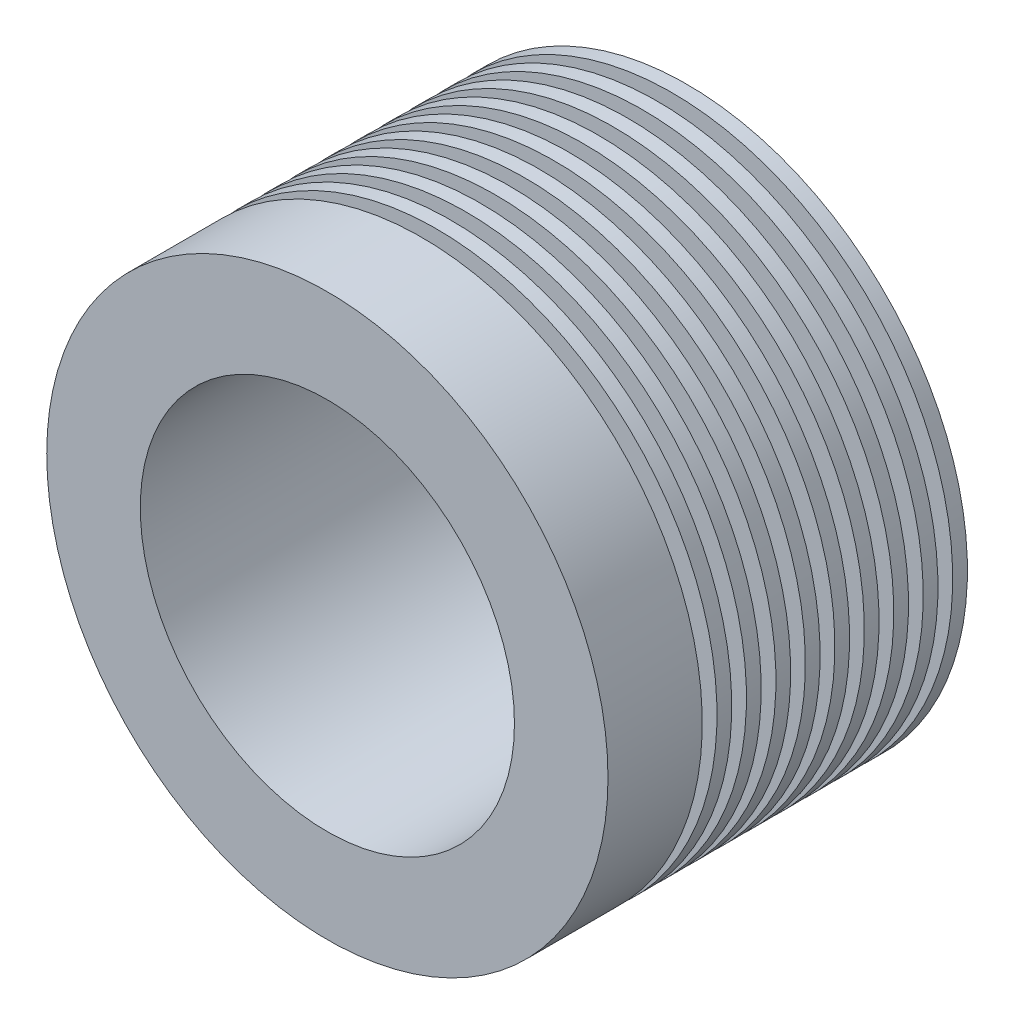
ISO-10303-21;
HEADER;
FILE_DESCRIPTION(('STEP AP214'),'2;1');
FILE_NAME('part.step','',(''),(''),'','','');
FILE_SCHEMA(('AUTOMOTIVE_DESIGN { 1 0 10303 214 1 1 1 1 }'));
ENDSEC;
DATA;
#1=APPLICATION_CONTEXT('core data for automotive mechanical design processes');
#2=APPLICATION_PROTOCOL_DEFINITION('international standard','automotive_design',2000,#1);
#3=PRODUCT_CONTEXT('',#1,'mechanical');
#4=PRODUCT('Part','Part','',(#3));
#5=PRODUCT_RELATED_PRODUCT_CATEGORY('part','',(#4));
#6=PRODUCT_DEFINITION_FORMATION('','',#4);
#7=PRODUCT_DEFINITION_CONTEXT('part definition',#1,'design');
#8=PRODUCT_DEFINITION('design','',#6,#7);
#9=PRODUCT_DEFINITION_SHAPE('','',#8);
#10=(LENGTH_UNIT() NAMED_UNIT(*) SI_UNIT(.MILLI.,.METRE.));
#11=(NAMED_UNIT(*) PLANE_ANGLE_UNIT() SI_UNIT($,.RADIAN.));
#12=(NAMED_UNIT(*) SI_UNIT($,.STERADIAN.) SOLID_ANGLE_UNIT());
#13=UNCERTAINTY_MEASURE_WITH_UNIT(LENGTH_MEASURE(1.E-05),#10,'distance_accuracy_value','');
#14=(GEOMETRIC_REPRESENTATION_CONTEXT(3) GLOBAL_UNCERTAINTY_ASSIGNED_CONTEXT((#13)) GLOBAL_UNIT_ASSIGNED_CONTEXT((#10,
#11,#12)) REPRESENTATION_CONTEXT('',''));
#15=CARTESIAN_POINT('',(0.,0.,0.));
#16=DIRECTION('',(0.,0.,1.));
#17=DIRECTION('',(1.,0.,0.));
#18=AXIS2_PLACEMENT_3D('',#15,#16,#17);
#19=CARTESIAN_POINT('',(0.,0.,50.8));
#20=DIRECTION('',(0.,0.,-1.));
#21=DIRECTION('',(-1.,0.,0.));
#22=AXIS2_PLACEMENT_3D('',#19,#20,#21);
#23=CYLINDRICAL_SURFACE('',#22,38.1);
#24=CARTESIAN_POINT('',(0.,0.,4.));
#25=DIRECTION('',(0.,0.,-1.));
#26=DIRECTION('',(-1.,0.,0.));
#27=AXIS2_PLACEMENT_3D('',#24,#25,#26);
#28=CIRCLE('',#27,38.1);
#29=CARTESIAN_POINT('',(-38.1,0.,4.));
#30=VERTEX_POINT('',#29);
#31=EDGE_CURVE('E131',#30,#30,#28,.T.);
#32=ORIENTED_EDGE('',*,*,#31,.T.);
#33=EDGE_LOOP('',(#32));
#34=FACE_BOUND('',#33,.T.);
#35=CARTESIAN_POINT('',(0.,0.,2.));
#36=DIRECTION('',(0.,0.,-1.));
#37=DIRECTION('',(-1.,0.,0.));
#38=AXIS2_PLACEMENT_3D('',#35,#36,#37);
#39=CIRCLE('',#38,38.1);
#40=CARTESIAN_POINT('',(-38.1,0.,2.));
#41=VERTEX_POINT('',#40);
#42=EDGE_CURVE('E55',#41,#41,#39,.T.);
#43=ORIENTED_EDGE('',*,*,#42,.F.);
#44=EDGE_LOOP('',(#43));
#45=FACE_BOUND('',#44,.T.);
#46=ADVANCED_FACE('F47',(#34,#45),#23,.T.);
#47=CARTESIAN_POINT('',(0.,0.,2.));
#48=DIRECTION('',(0.,0.,-1.));
#49=DIRECTION('',(-1.,0.,0.));
#50=AXIS2_PLACEMENT_3D('',#47,#48,#49);
#51=PLANE('',#50);
#52=CARTESIAN_POINT('',(0.,0.,2.));
#53=DIRECTION('',(0.,0.,-1.));
#54=DIRECTION('',(-1.,0.,0.));
#55=AXIS2_PLACEMENT_3D('',#52,#53,#54);
#56=CIRCLE('',#55,31.75);
#57=CARTESIAN_POINT('',(-31.75,0.,2.));
#58=VERTEX_POINT('',#57);
#59=EDGE_CURVE('E61',#58,#58,#56,.T.);
#60=ORIENTED_EDGE('',*,*,#59,.F.);
#61=EDGE_LOOP('',(#60));
#62=FACE_BOUND('',#61,.T.);
#63=ORIENTED_EDGE('',*,*,#42,.T.);
#64=EDGE_LOOP('',(#63));
#65=FACE_BOUND('',#64,.T.);
#66=ADVANCED_FACE('F253',(#62,#65),#51,.T.);
#67=CARTESIAN_POINT('',(0.,0.,2.));
#68=DIRECTION('',(0.,0.,-1.));
#69=DIRECTION('',(-1.,0.,0.));
#70=AXIS2_PLACEMENT_3D('',#67,#68,#69);
#71=CYLINDRICAL_SURFACE('',#70,31.75);
#72=ORIENTED_EDGE('',*,*,#59,.T.);
#73=EDGE_LOOP('',(#72));
#74=FACE_BOUND('',#73,.T.);
#75=CARTESIAN_POINT('',(0.,0.,0.));
#76=DIRECTION('',(0.,0.,-1.));
#77=DIRECTION('',(-1.,0.,0.));
#78=AXIS2_PLACEMENT_3D('',#75,#76,#77);
#79=CIRCLE('',#78,31.75);
#80=CARTESIAN_POINT('',(-31.75,0.,0.));
#81=VERTEX_POINT('',#80);
#82=EDGE_CURVE('E64',#81,#81,#79,.T.);
#83=ORIENTED_EDGE('',*,*,#82,.F.);
#84=EDGE_LOOP('',(#83));
#85=FACE_BOUND('',#84,.T.);
#86=ADVANCED_FACE('F258',(#74,#85),#71,.T.);
#87=CARTESIAN_POINT('',(0.,0.,0.));
#88=DIRECTION('',(0.,0.,1.));
#89=DIRECTION('',(1.,0.,0.));
#90=AXIS2_PLACEMENT_3D('',#87,#88,#89);
#91=PLANE('',#90);
#92=ORIENTED_EDGE('',*,*,#82,.T.);
#93=EDGE_LOOP('',(#92));
#94=FACE_BOUND('',#93,.T.);
#95=ADVANCED_FACE('F390',(#94),#91,.F.);
#96=CARTESIAN_POINT('',(0.,0.,6.));
#97=DIRECTION('',(0.,0.,-1.));
#98=DIRECTION('',(-1.,0.,0.));
#99=AXIS2_PLACEMENT_3D('',#96,#97,#98);
#100=PLANE('',#99);
#101=CARTESIAN_POINT('',(0.,0.,6.));
#102=DIRECTION('',(0.,0.,-1.));
#103=DIRECTION('',(-1.,0.,0.));
#104=AXIS2_PLACEMENT_3D('',#101,#102,#103);
#105=CIRCLE('',#104,31.75);
#106=CARTESIAN_POINT('',(-31.75,0.,6.));
#107=VERTEX_POINT('',#106);
#108=EDGE_CURVE('E72',#107,#107,#105,.T.);
#109=ORIENTED_EDGE('',*,*,#108,.F.);
#110=EDGE_LOOP('',(#109));
#111=FACE_BOUND('',#110,.T.);
#112=CARTESIAN_POINT('',(0.,0.,6.));
#113=DIRECTION('',(0.,0.,-1.));
#114=DIRECTION('',(-1.,0.,0.));
#115=AXIS2_PLACEMENT_3D('',#112,#113,#114);
#116=CIRCLE('',#115,38.1);
#117=CARTESIAN_POINT('',(-38.1,0.,6.));
#118=VERTEX_POINT('',#117);
#119=EDGE_CURVE('E50',#118,#118,#116,.T.);
#120=ORIENTED_EDGE('',*,*,#119,.T.);
#121=EDGE_LOOP('',(#120));
#122=FACE_BOUND('',#121,.T.);
#123=ADVANCED_FACE('F394',(#111,#122),#100,.T.);
#124=CARTESIAN_POINT('',(0.,0.,4.));
#125=DIRECTION('',(0.,0.,-1.));
#126=DIRECTION('',(-1.,0.,0.));
#127=AXIS2_PLACEMENT_3D('',#124,#125,#126);
#128=PLANE('',#127);
#129=CARTESIAN_POINT('',(0.,0.,4.));
#130=DIRECTION('',(0.,0.,-1.));
#131=DIRECTION('',(-1.,0.,0.));
#132=AXIS2_PLACEMENT_3D('',#129,#130,#131);
#133=CIRCLE('',#132,31.75);
#134=CARTESIAN_POINT('',(-31.75,0.,4.));
#135=VERTEX_POINT('',#134);
#136=EDGE_CURVE('E214',#135,#135,#133,.T.);
#137=ORIENTED_EDGE('',*,*,#136,.T.);
#138=EDGE_LOOP('',(#137));
#139=FACE_BOUND('',#138,.T.);
#140=ORIENTED_EDGE('',*,*,#31,.F.);
#141=EDGE_LOOP('',(#140));
#142=FACE_BOUND('',#141,.T.);
#143=ADVANCED_FACE('F273',(#139,#142),#128,.F.);
#144=CARTESIAN_POINT('',(0.,0.,6.));
#145=DIRECTION('',(0.,0.,-1.));
#146=DIRECTION('',(-1.,0.,0.));
#147=AXIS2_PLACEMENT_3D('',#144,#145,#146);
#148=CYLINDRICAL_SURFACE('',#147,31.75);
#149=ORIENTED_EDGE('',*,*,#108,.T.);
#150=EDGE_LOOP('',(#149));
#151=FACE_BOUND('',#150,.T.);
#152=ORIENTED_EDGE('',*,*,#136,.F.);
#153=EDGE_LOOP('',(#152));
#154=FACE_BOUND('',#153,.T.);
#155=ADVANCED_FACE('F263',(#151,#154),#148,.T.);
#156=CARTESIAN_POINT('',(0.,0.,8.));
#157=DIRECTION('',(0.,0.,-1.));
#158=DIRECTION('',(-1.,0.,0.));
#159=AXIS2_PLACEMENT_3D('',#156,#157,#158);
#160=CIRCLE('',#159,38.1);
#161=CARTESIAN_POINT('',(-38.1,0.,8.));
#162=VERTEX_POINT('',#161);
#163=EDGE_CURVE('E124',#162,#162,#160,.T.);
#164=ORIENTED_EDGE('',*,*,#163,.T.);
#165=EDGE_LOOP('',(#164));
#166=FACE_BOUND('',#165,.T.);
#167=ORIENTED_EDGE('',*,*,#119,.F.);
#168=EDGE_LOOP('',(#167));
#169=FACE_BOUND('',#168,.T.);
#170=ADVANCED_FACE('F254',(#166,#169),#23,.T.);
#171=CARTESIAN_POINT('',(0.,0.,10.));
#172=DIRECTION('',(0.,0.,-1.));
#173=DIRECTION('',(-1.,0.,0.));
#174=AXIS2_PLACEMENT_3D('',#171,#172,#173);
#175=PLANE('',#174);
#176=CARTESIAN_POINT('',(0.,0.,10.));
#177=DIRECTION('',(0.,0.,-1.));
#178=DIRECTION('',(-1.,0.,0.));
#179=AXIS2_PLACEMENT_3D('',#176,#177,#178);
#180=CIRCLE('',#179,31.75);
#181=CARTESIAN_POINT('',(-31.75,0.,10.));
#182=VERTEX_POINT('',#181);
#183=EDGE_CURVE('E210',#182,#182,#180,.T.);
#184=ORIENTED_EDGE('',*,*,#183,.F.);
#185=EDGE_LOOP('',(#184));
#186=FACE_BOUND('',#185,.T.);
#187=CARTESIAN_POINT('',(0.,0.,10.));
#188=DIRECTION('',(0.,0.,-1.));
#189=DIRECTION('',(-1.,0.,0.));
#190=AXIS2_PLACEMENT_3D('',#187,#188,#189);
#191=CIRCLE('',#190,38.1);
#192=CARTESIAN_POINT('',(-38.1,0.,10.));
#193=VERTEX_POINT('',#192);
#194=EDGE_CURVE('E128',#193,#193,#191,.T.);
#195=ORIENTED_EDGE('',*,*,#194,.T.);
#196=EDGE_LOOP('',(#195));
#197=FACE_BOUND('',#196,.T.);
#198=ADVANCED_FACE('F262',(#186,#197),#175,.T.);
#199=CARTESIAN_POINT('',(0.,0.,8.));
#200=DIRECTION('',(0.,0.,-1.));
#201=DIRECTION('',(-1.,0.,0.));
#202=AXIS2_PLACEMENT_3D('',#199,#200,#201);
#203=PLANE('',#202);
#204=CARTESIAN_POINT('',(0.,0.,8.));
#205=DIRECTION('',(0.,0.,-1.));
#206=DIRECTION('',(-1.,0.,0.));
#207=AXIS2_PLACEMENT_3D('',#204,#205,#206);
#208=CIRCLE('',#207,31.75);
#209=CARTESIAN_POINT('',(-31.75,0.,8.));
#210=VERTEX_POINT('',#209);
#211=EDGE_CURVE('E206',#210,#210,#208,.T.);
#212=ORIENTED_EDGE('',*,*,#211,.T.);
#213=EDGE_LOOP('',(#212));
#214=FACE_BOUND('',#213,.T.);
#215=ORIENTED_EDGE('',*,*,#163,.F.);
#216=EDGE_LOOP('',(#215));
#217=FACE_BOUND('',#216,.T.);
#218=ADVANCED_FACE('F270',(#214,#217),#203,.F.);
#219=CARTESIAN_POINT('',(0.,0.,10.));
#220=DIRECTION('',(0.,0.,-1.));
#221=DIRECTION('',(-1.,0.,0.));
#222=AXIS2_PLACEMENT_3D('',#219,#220,#221);
#223=CYLINDRICAL_SURFACE('',#222,31.75);
#224=ORIENTED_EDGE('',*,*,#183,.T.);
#225=EDGE_LOOP('',(#224));
#226=FACE_BOUND('',#225,.T.);
#227=ORIENTED_EDGE('',*,*,#211,.F.);
#228=EDGE_LOOP('',(#227));
#229=FACE_BOUND('',#228,.T.);
#230=ADVANCED_FACE('F279',(#226,#229),#223,.T.);
#231=CARTESIAN_POINT('',(0.,0.,12.));
#232=DIRECTION('',(0.,0.,-1.));
#233=DIRECTION('',(-1.,0.,0.));
#234=AXIS2_PLACEMENT_3D('',#231,#232,#233);
#235=CIRCLE('',#234,38.1);
#236=CARTESIAN_POINT('',(-38.1,0.,12.));
#237=VERTEX_POINT('',#236);
#238=EDGE_CURVE('E116',#237,#237,#235,.T.);
#239=ORIENTED_EDGE('',*,*,#238,.T.);
#240=EDGE_LOOP('',(#239));
#241=FACE_BOUND('',#240,.T.);
#242=ORIENTED_EDGE('',*,*,#194,.F.);
#243=EDGE_LOOP('',(#242));
#244=FACE_BOUND('',#243,.T.);
#245=ADVANCED_FACE('F265',(#241,#244),#23,.T.);
#246=CARTESIAN_POINT('',(0.,0.,14.));
#247=DIRECTION('',(0.,0.,-1.));
#248=DIRECTION('',(-1.,0.,0.));
#249=AXIS2_PLACEMENT_3D('',#246,#247,#248);
#250=PLANE('',#249);
#251=CARTESIAN_POINT('',(0.,0.,14.));
#252=DIRECTION('',(0.,0.,-1.));
#253=DIRECTION('',(-1.,0.,0.));
#254=AXIS2_PLACEMENT_3D('',#251,#252,#253);
#255=CIRCLE('',#254,31.75);
#256=CARTESIAN_POINT('',(-31.75,0.,14.));
#257=VERTEX_POINT('',#256);
#258=EDGE_CURVE('E202',#257,#257,#255,.T.);
#259=ORIENTED_EDGE('',*,*,#258,.F.);
#260=EDGE_LOOP('',(#259));
#261=FACE_BOUND('',#260,.T.);
#262=CARTESIAN_POINT('',(0.,0.,14.));
#263=DIRECTION('',(0.,0.,-1.));
#264=DIRECTION('',(-1.,0.,0.));
#265=AXIS2_PLACEMENT_3D('',#262,#263,#264);
#266=CIRCLE('',#265,38.1);
#267=CARTESIAN_POINT('',(-38.1,0.,14.));
#268=VERTEX_POINT('',#267);
#269=EDGE_CURVE('E120',#268,#268,#266,.T.);
#270=ORIENTED_EDGE('',*,*,#269,.T.);
#271=EDGE_LOOP('',(#270));
#272=FACE_BOUND('',#271,.T.);
#273=ADVANCED_FACE('F278',(#261,#272),#250,.T.);
#274=CARTESIAN_POINT('',(0.,0.,12.));
#275=DIRECTION('',(0.,0.,-1.));
#276=DIRECTION('',(-1.,0.,0.));
#277=AXIS2_PLACEMENT_3D('',#274,#275,#276);
#278=PLANE('',#277);
#279=CARTESIAN_POINT('',(0.,0.,12.));
#280=DIRECTION('',(0.,0.,-1.));
#281=DIRECTION('',(-1.,0.,0.));
#282=AXIS2_PLACEMENT_3D('',#279,#280,#281);
#283=CIRCLE('',#282,31.75);
#284=CARTESIAN_POINT('',(-31.75,0.,12.));
#285=VERTEX_POINT('',#284);
#286=EDGE_CURVE('E198',#285,#285,#283,.T.);
#287=ORIENTED_EDGE('',*,*,#286,.T.);
#288=EDGE_LOOP('',(#287));
#289=FACE_BOUND('',#288,.T.);
#290=ORIENTED_EDGE('',*,*,#238,.F.);
#291=EDGE_LOOP('',(#290));
#292=FACE_BOUND('',#291,.T.);
#293=ADVANCED_FACE('F286',(#289,#292),#278,.F.);
#294=CARTESIAN_POINT('',(0.,0.,14.));
#295=DIRECTION('',(0.,0.,-1.));
#296=DIRECTION('',(-1.,0.,0.));
#297=AXIS2_PLACEMENT_3D('',#294,#295,#296);
#298=CYLINDRICAL_SURFACE('',#297,31.75);
#299=ORIENTED_EDGE('',*,*,#258,.T.);
#300=EDGE_LOOP('',(#299));
#301=FACE_BOUND('',#300,.T.);
#302=ORIENTED_EDGE('',*,*,#286,.F.);
#303=EDGE_LOOP('',(#302));
#304=FACE_BOUND('',#303,.T.);
#305=ADVANCED_FACE('F294',(#301,#304),#298,.T.);
#306=CARTESIAN_POINT('',(0.,0.,16.));
#307=DIRECTION('',(0.,0.,-1.));
#308=DIRECTION('',(-1.,0.,0.));
#309=AXIS2_PLACEMENT_3D('',#306,#307,#308);
#310=CIRCLE('',#309,38.1);
#311=CARTESIAN_POINT('',(-38.1,0.,16.));
#312=VERTEX_POINT('',#311);
#313=EDGE_CURVE('E108',#312,#312,#310,.T.);
#314=ORIENTED_EDGE('',*,*,#313,.T.);
#315=EDGE_LOOP('',(#314));
#316=FACE_BOUND('',#315,.T.);
#317=ORIENTED_EDGE('',*,*,#269,.F.);
#318=EDGE_LOOP('',(#317));
#319=FACE_BOUND('',#318,.T.);
#320=ADVANCED_FACE('F281',(#316,#319),#23,.T.);
#321=CARTESIAN_POINT('',(0.,0.,18.));
#322=DIRECTION('',(0.,0.,-1.));
#323=DIRECTION('',(-1.,0.,0.));
#324=AXIS2_PLACEMENT_3D('',#321,#322,#323);
#325=PLANE('',#324);
#326=CARTESIAN_POINT('',(0.,0.,18.));
#327=DIRECTION('',(0.,0.,-1.));
#328=DIRECTION('',(-1.,0.,0.));
#329=AXIS2_PLACEMENT_3D('',#326,#327,#328);
#330=CIRCLE('',#329,31.75);
#331=CARTESIAN_POINT('',(-31.75,0.,18.));
#332=VERTEX_POINT('',#331);
#333=EDGE_CURVE('E194',#332,#332,#330,.T.);
#334=ORIENTED_EDGE('',*,*,#333,.F.);
#335=EDGE_LOOP('',(#334));
#336=FACE_BOUND('',#335,.T.);
#337=CARTESIAN_POINT('',(0.,0.,18.));
#338=DIRECTION('',(0.,0.,-1.));
#339=DIRECTION('',(-1.,0.,0.));
#340=AXIS2_PLACEMENT_3D('',#337,#338,#339);
#341=CIRCLE('',#340,38.1);
#342=CARTESIAN_POINT('',(-38.1,0.,18.));
#343=VERTEX_POINT('',#342);
#344=EDGE_CURVE('E112',#343,#343,#341,.T.);
#345=ORIENTED_EDGE('',*,*,#344,.T.);
#346=EDGE_LOOP('',(#345));
#347=FACE_BOUND('',#346,.T.);
#348=ADVANCED_FACE('F293',(#336,#347),#325,.T.);
#349=CARTESIAN_POINT('',(0.,0.,16.));
#350=DIRECTION('',(0.,0.,-1.));
#351=DIRECTION('',(-1.,0.,0.));
#352=AXIS2_PLACEMENT_3D('',#349,#350,#351);
#353=PLANE('',#352);
#354=CARTESIAN_POINT('',(0.,0.,16.));
#355=DIRECTION('',(0.,0.,-1.));
#356=DIRECTION('',(-1.,0.,0.));
#357=AXIS2_PLACEMENT_3D('',#354,#355,#356);
#358=CIRCLE('',#357,31.75);
#359=CARTESIAN_POINT('',(-31.75,0.,16.));
#360=VERTEX_POINT('',#359);
#361=EDGE_CURVE('E190',#360,#360,#358,.T.);
#362=ORIENTED_EDGE('',*,*,#361,.T.);
#363=EDGE_LOOP('',(#362));
#364=FACE_BOUND('',#363,.T.);
#365=ORIENTED_EDGE('',*,*,#313,.F.);
#366=EDGE_LOOP('',(#365));
#367=FACE_BOUND('',#366,.T.);
#368=ADVANCED_FACE('F301',(#364,#367),#353,.F.);
#369=CARTESIAN_POINT('',(0.,0.,18.));
#370=DIRECTION('',(0.,0.,-1.));
#371=DIRECTION('',(-1.,0.,0.));
#372=AXIS2_PLACEMENT_3D('',#369,#370,#371);
#373=CYLINDRICAL_SURFACE('',#372,31.75);
#374=ORIENTED_EDGE('',*,*,#333,.T.);
#375=EDGE_LOOP('',(#374));
#376=FACE_BOUND('',#375,.T.);
#377=ORIENTED_EDGE('',*,*,#361,.F.);
#378=EDGE_LOOP('',(#377));
#379=FACE_BOUND('',#378,.T.);
#380=ADVANCED_FACE('F309',(#376,#379),#373,.T.);
#381=CARTESIAN_POINT('',(0.,0.,20.));
#382=DIRECTION('',(0.,0.,-1.));
#383=DIRECTION('',(-1.,0.,0.));
#384=AXIS2_PLACEMENT_3D('',#381,#382,#383);
#385=CIRCLE('',#384,38.1);
#386=CARTESIAN_POINT('',(-38.1,0.,20.));
#387=VERTEX_POINT('',#386);
#388=EDGE_CURVE('E100',#387,#387,#385,.T.);
#389=ORIENTED_EDGE('',*,*,#388,.T.);
#390=EDGE_LOOP('',(#389));
#391=FACE_BOUND('',#390,.T.);
#392=ORIENTED_EDGE('',*,*,#344,.F.);
#393=EDGE_LOOP('',(#392));
#394=FACE_BOUND('',#393,.T.);
#395=ADVANCED_FACE('F296',(#391,#394),#23,.T.);
#396=CARTESIAN_POINT('',(0.,0.,22.));
#397=DIRECTION('',(0.,0.,-1.));
#398=DIRECTION('',(-1.,0.,0.));
#399=AXIS2_PLACEMENT_3D('',#396,#397,#398);
#400=PLANE('',#399);
#401=CARTESIAN_POINT('',(0.,0.,22.));
#402=DIRECTION('',(0.,0.,-1.));
#403=DIRECTION('',(-1.,0.,0.));
#404=AXIS2_PLACEMENT_3D('',#401,#402,#403);
#405=CIRCLE('',#404,31.75);
#406=CARTESIAN_POINT('',(-31.75,0.,22.));
#407=VERTEX_POINT('',#406);
#408=EDGE_CURVE('E186',#407,#407,#405,.T.);
#409=ORIENTED_EDGE('',*,*,#408,.F.);
#410=EDGE_LOOP('',(#409));
#411=FACE_BOUND('',#410,.T.);
#412=CARTESIAN_POINT('',(0.,0.,22.));
#413=DIRECTION('',(0.,0.,-1.));
#414=DIRECTION('',(-1.,0.,0.));
#415=AXIS2_PLACEMENT_3D('',#412,#413,#414);
#416=CIRCLE('',#415,38.1);
#417=CARTESIAN_POINT('',(-38.1,0.,22.));
#418=VERTEX_POINT('',#417);
#419=EDGE_CURVE('E104',#418,#418,#416,.T.);
#420=ORIENTED_EDGE('',*,*,#419,.T.);
#421=EDGE_LOOP('',(#420));
#422=FACE_BOUND('',#421,.T.);
#423=ADVANCED_FACE('F308',(#411,#422),#400,.T.);
#424=CARTESIAN_POINT('',(0.,0.,20.));
#425=DIRECTION('',(0.,0.,-1.));
#426=DIRECTION('',(-1.,0.,0.));
#427=AXIS2_PLACEMENT_3D('',#424,#425,#426);
#428=PLANE('',#427);
#429=CARTESIAN_POINT('',(0.,0.,20.));
#430=DIRECTION('',(0.,0.,-1.));
#431=DIRECTION('',(-1.,0.,0.));
#432=AXIS2_PLACEMENT_3D('',#429,#430,#431);
#433=CIRCLE('',#432,31.75);
#434=CARTESIAN_POINT('',(-31.75,0.,20.));
#435=VERTEX_POINT('',#434);
#436=EDGE_CURVE('E182',#435,#435,#433,.T.);
#437=ORIENTED_EDGE('',*,*,#436,.T.);
#438=EDGE_LOOP('',(#437));
#439=FACE_BOUND('',#438,.T.);
#440=ORIENTED_EDGE('',*,*,#388,.F.);
#441=EDGE_LOOP('',(#440));
#442=FACE_BOUND('',#441,.T.);
#443=ADVANCED_FACE('F316',(#439,#442),#428,.F.);
#444=CARTESIAN_POINT('',(0.,0.,22.));
#445=DIRECTION('',(0.,0.,-1.));
#446=DIRECTION('',(-1.,0.,0.));
#447=AXIS2_PLACEMENT_3D('',#444,#445,#446);
#448=CYLINDRICAL_SURFACE('',#447,31.75);
#449=ORIENTED_EDGE('',*,*,#408,.T.);
#450=EDGE_LOOP('',(#449));
#451=FACE_BOUND('',#450,.T.);
#452=ORIENTED_EDGE('',*,*,#436,.F.);
#453=EDGE_LOOP('',(#452));
#454=FACE_BOUND('',#453,.T.);
#455=ADVANCED_FACE('F324',(#451,#454),#448,.T.);
#456=CARTESIAN_POINT('',(0.,0.,24.));
#457=DIRECTION('',(0.,0.,-1.));
#458=DIRECTION('',(-1.,0.,0.));
#459=AXIS2_PLACEMENT_3D('',#456,#457,#458);
#460=CIRCLE('',#459,38.1);
#461=CARTESIAN_POINT('',(-38.1,0.,24.));
#462=VERTEX_POINT('',#461);
#463=EDGE_CURVE('E92',#462,#462,#460,.T.);
#464=ORIENTED_EDGE('',*,*,#463,.T.);
#465=EDGE_LOOP('',(#464));
#466=FACE_BOUND('',#465,.T.);
#467=ORIENTED_EDGE('',*,*,#419,.F.);
#468=EDGE_LOOP('',(#467));
#469=FACE_BOUND('',#468,.T.);
#470=ADVANCED_FACE('F311',(#466,#469),#23,.T.);
#471=CARTESIAN_POINT('',(0.,0.,26.));
#472=DIRECTION('',(0.,0.,-1.));
#473=DIRECTION('',(-1.,0.,0.));
#474=AXIS2_PLACEMENT_3D('',#471,#472,#473);
#475=PLANE('',#474);
#476=CARTESIAN_POINT('',(0.,0.,26.));
#477=DIRECTION('',(0.,0.,-1.));
#478=DIRECTION('',(-1.,0.,0.));
#479=AXIS2_PLACEMENT_3D('',#476,#477,#478);
#480=CIRCLE('',#479,31.75);
#481=CARTESIAN_POINT('',(-31.75,0.,26.));
#482=VERTEX_POINT('',#481);
#483=EDGE_CURVE('E178',#482,#482,#480,.T.);
#484=ORIENTED_EDGE('',*,*,#483,.F.);
#485=EDGE_LOOP('',(#484));
#486=FACE_BOUND('',#485,.T.);
#487=CARTESIAN_POINT('',(0.,0.,26.));
#488=DIRECTION('',(0.,0.,-1.));
#489=DIRECTION('',(-1.,0.,0.));
#490=AXIS2_PLACEMENT_3D('',#487,#488,#489);
#491=CIRCLE('',#490,38.1);
#492=CARTESIAN_POINT('',(-38.1,0.,26.));
#493=VERTEX_POINT('',#492);
#494=EDGE_CURVE('E96',#493,#493,#491,.T.);
#495=ORIENTED_EDGE('',*,*,#494,.T.);
#496=EDGE_LOOP('',(#495));
#497=FACE_BOUND('',#496,.T.);
#498=ADVANCED_FACE('F323',(#486,#497),#475,.T.);
#499=CARTESIAN_POINT('',(0.,0.,24.));
#500=DIRECTION('',(0.,0.,-1.));
#501=DIRECTION('',(-1.,0.,0.));
#502=AXIS2_PLACEMENT_3D('',#499,#500,#501);
#503=PLANE('',#502);
#504=CARTESIAN_POINT('',(0.,0.,24.));
#505=DIRECTION('',(0.,0.,-1.));
#506=DIRECTION('',(-1.,0.,0.));
#507=AXIS2_PLACEMENT_3D('',#504,#505,#506);
#508=CIRCLE('',#507,31.75);
#509=CARTESIAN_POINT('',(-31.75,0.,24.));
#510=VERTEX_POINT('',#509);
#511=EDGE_CURVE('E174',#510,#510,#508,.T.);
#512=ORIENTED_EDGE('',*,*,#511,.T.);
#513=EDGE_LOOP('',(#512));
#514=FACE_BOUND('',#513,.T.);
#515=ORIENTED_EDGE('',*,*,#463,.F.);
#516=EDGE_LOOP('',(#515));
#517=FACE_BOUND('',#516,.T.);
#518=ADVANCED_FACE('F331',(#514,#517),#503,.F.);
#519=CARTESIAN_POINT('',(0.,0.,26.));
#520=DIRECTION('',(0.,0.,-1.));
#521=DIRECTION('',(-1.,0.,0.));
#522=AXIS2_PLACEMENT_3D('',#519,#520,#521);
#523=CYLINDRICAL_SURFACE('',#522,31.75);
#524=ORIENTED_EDGE('',*,*,#483,.T.);
#525=EDGE_LOOP('',(#524));
#526=FACE_BOUND('',#525,.T.);
#527=ORIENTED_EDGE('',*,*,#511,.F.);
#528=EDGE_LOOP('',(#527));
#529=FACE_BOUND('',#528,.T.);
#530=ADVANCED_FACE('F339',(#526,#529),#523,.T.);
#531=CARTESIAN_POINT('',(0.,0.,28.));
#532=DIRECTION('',(0.,0.,-1.));
#533=DIRECTION('',(-1.,0.,0.));
#534=AXIS2_PLACEMENT_3D('',#531,#532,#533);
#535=CIRCLE('',#534,38.1);
#536=CARTESIAN_POINT('',(-38.1,0.,28.));
#537=VERTEX_POINT('',#536);
#538=EDGE_CURVE('E84',#537,#537,#535,.T.);
#539=ORIENTED_EDGE('',*,*,#538,.T.);
#540=EDGE_LOOP('',(#539));
#541=FACE_BOUND('',#540,.T.);
#542=ORIENTED_EDGE('',*,*,#494,.F.);
#543=EDGE_LOOP('',(#542));
#544=FACE_BOUND('',#543,.T.);
#545=ADVANCED_FACE('F326',(#541,#544),#23,.T.);
#546=CARTESIAN_POINT('',(0.,0.,30.));
#547=DIRECTION('',(0.,0.,-1.));
#548=DIRECTION('',(-1.,0.,0.));
#549=AXIS2_PLACEMENT_3D('',#546,#547,#548);
#550=PLANE('',#549);
#551=CARTESIAN_POINT('',(0.,0.,30.));
#552=DIRECTION('',(0.,0.,-1.));
#553=DIRECTION('',(-1.,0.,0.));
#554=AXIS2_PLACEMENT_3D('',#551,#552,#553);
#555=CIRCLE('',#554,31.75);
#556=CARTESIAN_POINT('',(-31.75,0.,30.));
#557=VERTEX_POINT('',#556);
#558=EDGE_CURVE('E170',#557,#557,#555,.T.);
#559=ORIENTED_EDGE('',*,*,#558,.F.);
#560=EDGE_LOOP('',(#559));
#561=FACE_BOUND('',#560,.T.);
#562=CARTESIAN_POINT('',(0.,0.,30.));
#563=DIRECTION('',(0.,0.,-1.));
#564=DIRECTION('',(-1.,0.,0.));
#565=AXIS2_PLACEMENT_3D('',#562,#563,#564);
#566=CIRCLE('',#565,38.1);
#567=CARTESIAN_POINT('',(-38.1,0.,30.));
#568=VERTEX_POINT('',#567);
#569=EDGE_CURVE('E88',#568,#568,#566,.T.);
#570=ORIENTED_EDGE('',*,*,#569,.T.);
#571=EDGE_LOOP('',(#570));
#572=FACE_BOUND('',#571,.T.);
#573=ADVANCED_FACE('F338',(#561,#572),#550,.T.);
#574=CARTESIAN_POINT('',(0.,0.,28.));
#575=DIRECTION('',(0.,0.,-1.));
#576=DIRECTION('',(-1.,0.,0.));
#577=AXIS2_PLACEMENT_3D('',#574,#575,#576);
#578=PLANE('',#577);
#579=CARTESIAN_POINT('',(0.,0.,28.));
#580=DIRECTION('',(0.,0.,-1.));
#581=DIRECTION('',(-1.,0.,0.));
#582=AXIS2_PLACEMENT_3D('',#579,#580,#581);
#583=CIRCLE('',#582,31.75);
#584=CARTESIAN_POINT('',(-31.75,0.,28.));
#585=VERTEX_POINT('',#584);
#586=EDGE_CURVE('E166',#585,#585,#583,.T.);
#587=ORIENTED_EDGE('',*,*,#586,.T.);
#588=EDGE_LOOP('',(#587));
#589=FACE_BOUND('',#588,.T.);
#590=ORIENTED_EDGE('',*,*,#538,.F.);
#591=EDGE_LOOP('',(#590));
#592=FACE_BOUND('',#591,.T.);
#593=ADVANCED_FACE('F346',(#589,#592),#578,.F.);
#594=CARTESIAN_POINT('',(0.,0.,30.));
#595=DIRECTION('',(0.,0.,-1.));
#596=DIRECTION('',(-1.,0.,0.));
#597=AXIS2_PLACEMENT_3D('',#594,#595,#596);
#598=CYLINDRICAL_SURFACE('',#597,31.75);
#599=ORIENTED_EDGE('',*,*,#558,.T.);
#600=EDGE_LOOP('',(#599));
#601=FACE_BOUND('',#600,.T.);
#602=ORIENTED_EDGE('',*,*,#586,.F.);
#603=EDGE_LOOP('',(#602));
#604=FACE_BOUND('',#603,.T.);
#605=ADVANCED_FACE('F354',(#601,#604),#598,.T.);
#606=CARTESIAN_POINT('',(0.,0.,32.));
#607=DIRECTION('',(0.,0.,-1.));
#608=DIRECTION('',(-1.,0.,0.));
#609=AXIS2_PLACEMENT_3D('',#606,#607,#608);
#610=CIRCLE('',#609,38.1);
#611=CARTESIAN_POINT('',(-38.1,0.,32.));
#612=VERTEX_POINT('',#611);
#613=EDGE_CURVE('E76',#612,#612,#610,.T.);
#614=ORIENTED_EDGE('',*,*,#613,.T.);
#615=EDGE_LOOP('',(#614));
#616=FACE_BOUND('',#615,.T.);
#617=ORIENTED_EDGE('',*,*,#569,.F.);
#618=EDGE_LOOP('',(#617));
#619=FACE_BOUND('',#618,.T.);
#620=ADVANCED_FACE('F341',(#616,#619),#23,.T.);
#621=CARTESIAN_POINT('',(0.,0.,34.));
#622=DIRECTION('',(0.,0.,-1.));
#623=DIRECTION('',(-1.,0.,0.));
#624=AXIS2_PLACEMENT_3D('',#621,#622,#623);
#625=PLANE('',#624);
#626=CARTESIAN_POINT('',(0.,0.,34.));
#627=DIRECTION('',(0.,0.,-1.));
#628=DIRECTION('',(-1.,0.,0.));
#629=AXIS2_PLACEMENT_3D('',#626,#627,#628);
#630=CIRCLE('',#629,31.75);
#631=CARTESIAN_POINT('',(-31.75,0.,34.));
#632=VERTEX_POINT('',#631);
#633=EDGE_CURVE('E162',#632,#632,#630,.T.);
#634=ORIENTED_EDGE('',*,*,#633,.F.);
#635=EDGE_LOOP('',(#634));
#636=FACE_BOUND('',#635,.T.);
#637=CARTESIAN_POINT('',(0.,0.,34.));
#638=DIRECTION('',(0.,0.,-1.));
#639=DIRECTION('',(-1.,0.,0.));
#640=AXIS2_PLACEMENT_3D('',#637,#638,#639);
#641=CIRCLE('',#640,38.1);
#642=CARTESIAN_POINT('',(-38.1,0.,34.));
#643=VERTEX_POINT('',#642);
#644=EDGE_CURVE('E80',#643,#643,#641,.T.);
#645=ORIENTED_EDGE('',*,*,#644,.T.);
#646=EDGE_LOOP('',(#645));
#647=FACE_BOUND('',#646,.T.);
#648=ADVANCED_FACE('F353',(#636,#647),#625,.T.);
#649=CARTESIAN_POINT('',(0.,0.,32.));
#650=DIRECTION('',(0.,0.,-1.));
#651=DIRECTION('',(-1.,0.,0.));
#652=AXIS2_PLACEMENT_3D('',#649,#650,#651);
#653=PLANE('',#652);
#654=CARTESIAN_POINT('',(0.,0.,32.));
#655=DIRECTION('',(0.,0.,-1.));
#656=DIRECTION('',(-1.,0.,0.));
#657=AXIS2_PLACEMENT_3D('',#654,#655,#656);
#658=CIRCLE('',#657,31.75);
#659=CARTESIAN_POINT('',(-31.75,0.,32.));
#660=VERTEX_POINT('',#659);
#661=EDGE_CURVE('E158',#660,#660,#658,.T.);
#662=ORIENTED_EDGE('',*,*,#661,.T.);
#663=EDGE_LOOP('',(#662));
#664=FACE_BOUND('',#663,.T.);
#665=ORIENTED_EDGE('',*,*,#613,.F.);
#666=EDGE_LOOP('',(#665));
#667=FACE_BOUND('',#666,.T.);
#668=ADVANCED_FACE('F360',(#664,#667),#653,.F.);
#669=CARTESIAN_POINT('',(0.,0.,34.));
#670=DIRECTION('',(0.,0.,-1.));
#671=DIRECTION('',(-1.,0.,0.));
#672=AXIS2_PLACEMENT_3D('',#669,#670,#671);
#673=CYLINDRICAL_SURFACE('',#672,31.75);
#674=ORIENTED_EDGE('',*,*,#633,.T.);
#675=EDGE_LOOP('',(#674));
#676=FACE_BOUND('',#675,.T.);
#677=ORIENTED_EDGE('',*,*,#661,.F.);
#678=EDGE_LOOP('',(#677));
#679=FACE_BOUND('',#678,.T.);
#680=ADVANCED_FACE('F368',(#676,#679),#673,.T.);
#681=CARTESIAN_POINT('',(0.,0.,36.));
#682=DIRECTION('',(0.,0.,-1.));
#683=DIRECTION('',(-1.,0.,0.));
#684=AXIS2_PLACEMENT_3D('',#681,#682,#683);
#685=CIRCLE('',#684,38.1);
#686=CARTESIAN_POINT('',(-38.1,0.,36.));
#687=VERTEX_POINT('',#686);
#688=EDGE_CURVE('E67',#687,#687,#685,.T.);
#689=ORIENTED_EDGE('',*,*,#688,.T.);
#690=EDGE_LOOP('',(#689));
#691=FACE_BOUND('',#690,.T.);
#692=ORIENTED_EDGE('',*,*,#644,.F.);
#693=EDGE_LOOP('',(#692));
#694=FACE_BOUND('',#693,.T.);
#695=ADVANCED_FACE('F247',(#691,#694),#23,.T.);
#696=CARTESIAN_POINT('',(0.,0.,38.));
#697=DIRECTION('',(0.,0.,-1.));
#698=DIRECTION('',(-1.,0.,0.));
#699=AXIS2_PLACEMENT_3D('',#696,#697,#698);
#700=PLANE('',#699);
#701=CARTESIAN_POINT('',(0.,0.,38.));
#702=DIRECTION('',(0.,0.,-1.));
#703=DIRECTION('',(-1.,0.,0.));
#704=AXIS2_PLACEMENT_3D('',#701,#702,#703);
#705=CIRCLE('',#704,31.75);
#706=CARTESIAN_POINT('',(-31.75,0.,38.));
#707=VERTEX_POINT('',#706);
#708=EDGE_CURVE('E153',#707,#707,#705,.T.);
#709=ORIENTED_EDGE('',*,*,#708,.F.);
#710=EDGE_LOOP('',(#709));
#711=FACE_BOUND('',#710,.T.);
#712=CARTESIAN_POINT('',(0.,0.,38.));
#713=DIRECTION('',(0.,0.,-1.));
#714=DIRECTION('',(-1.,0.,0.));
#715=AXIS2_PLACEMENT_3D('',#712,#713,#714);
#716=CIRCLE('',#715,38.1);
#717=CARTESIAN_POINT('',(-38.1,0.,38.));
#718=VERTEX_POINT('',#717);
#719=EDGE_CURVE('E71',#718,#718,#716,.T.);
#720=ORIENTED_EDGE('',*,*,#719,.T.);
#721=EDGE_LOOP('',(#720));
#722=FACE_BOUND('',#721,.T.);
#723=ADVANCED_FACE('F367',(#711,#722),#700,.T.);
#724=CARTESIAN_POINT('',(0.,0.,36.));
#725=DIRECTION('',(0.,0.,-1.));
#726=DIRECTION('',(-1.,0.,0.));
#727=AXIS2_PLACEMENT_3D('',#724,#725,#726);
#728=PLANE('',#727);
#729=CARTESIAN_POINT('',(0.,0.,36.));
#730=DIRECTION('',(0.,0.,-1.));
#731=DIRECTION('',(-1.,0.,0.));
#732=AXIS2_PLACEMENT_3D('',#729,#730,#731);
#733=CIRCLE('',#732,31.75);
#734=CARTESIAN_POINT('',(-31.75,0.,36.));
#735=VERTEX_POINT('',#734);
#736=EDGE_CURVE('E149',#735,#735,#733,.T.);
#737=ORIENTED_EDGE('',*,*,#736,.T.);
#738=EDGE_LOOP('',(#737));
#739=FACE_BOUND('',#738,.T.);
#740=ORIENTED_EDGE('',*,*,#688,.F.);
#741=EDGE_LOOP('',(#740));
#742=FACE_BOUND('',#741,.T.);
#743=ADVANCED_FACE('F248',(#739,#742),#728,.F.);
#744=CARTESIAN_POINT('',(0.,0.,38.));
#745=DIRECTION('',(0.,0.,-1.));
#746=DIRECTION('',(-1.,0.,0.));
#747=AXIS2_PLACEMENT_3D('',#744,#745,#746);
#748=CYLINDRICAL_SURFACE('',#747,31.75);
#749=ORIENTED_EDGE('',*,*,#708,.T.);
#750=EDGE_LOOP('',(#749));
#751=FACE_BOUND('',#750,.T.);
#752=ORIENTED_EDGE('',*,*,#736,.F.);
#753=EDGE_LOOP('',(#752));
#754=FACE_BOUND('',#753,.T.);
#755=ADVANCED_FACE('F240',(#751,#754),#748,.T.);
#756=CARTESIAN_POINT('',(0.,0.,50.8));
#757=DIRECTION('',(0.,0.,1.));
#758=DIRECTION('',(1.,0.,0.));
#759=AXIS2_PLACEMENT_3D('',#756,#757,#758);
#760=PLANE('',#759);
#761=CARTESIAN_POINT('',(0.,0.,50.8));
#762=DIRECTION('',(0.,0.,1.));
#763=DIRECTION('',(1.,0.,0.));
#764=AXIS2_PLACEMENT_3D('',#761,#762,#763);
#765=CIRCLE('',#764,25.4);
#766=CARTESIAN_POINT('',(25.4,0.,50.8));
#767=VERTEX_POINT('',#766);
#768=EDGE_CURVE('E221',#767,#767,#765,.T.);
#769=ORIENTED_EDGE('',*,*,#768,.F.);
#770=EDGE_LOOP('',(#769));
#771=FACE_BOUND('',#770,.T.);
#772=CARTESIAN_POINT('',(0.,0.,50.8));
#773=DIRECTION('',(0.,0.,1.));
#774=DIRECTION('',(1.,0.,0.));
#775=AXIS2_PLACEMENT_3D('',#772,#773,#774);
#776=CIRCLE('',#775,38.1);
#777=CARTESIAN_POINT('',(38.1,0.,50.8));
#778=VERTEX_POINT('',#777);
#779=EDGE_CURVE('E11',#778,#778,#776,.T.);
#780=ORIENTED_EDGE('',*,*,#779,.T.);
#781=EDGE_LOOP('',(#780));
#782=FACE_BOUND('',#781,.T.);
#783=ADVANCED_FACE('F238',(#771,#782),#760,.T.);
#784=ORIENTED_EDGE('',*,*,#779,.F.);
#785=EDGE_LOOP('',(#784));
#786=FACE_BOUND('',#785,.T.);
#787=ORIENTED_EDGE('',*,*,#719,.F.);
#788=EDGE_LOOP('',(#787));
#789=FACE_BOUND('',#788,.T.);
#790=ADVANCED_FACE('F234',(#786,#789),#23,.T.);
#791=CARTESIAN_POINT('',(0.,0.,6.35));
#792=DIRECTION('',(0.,0.,1.));
#793=DIRECTION('',(1.,0.,0.));
#794=AXIS2_PLACEMENT_3D('',#791,#792,#793);
#795=CYLINDRICAL_SURFACE('',#794,25.4);
#796=CARTESIAN_POINT('',(0.,0.,6.35));
#797=DIRECTION('',(0.,0.,1.));
#798=DIRECTION('',(1.,0.,0.));
#799=AXIS2_PLACEMENT_3D('',#796,#797,#798);
#800=CIRCLE('',#799,25.4);
#801=CARTESIAN_POINT('',(25.4,0.,6.35));
#802=VERTEX_POINT('',#801);
#803=EDGE_CURVE('E154',#802,#802,#800,.T.);
#804=ORIENTED_EDGE('',*,*,#803,.F.);
#805=EDGE_LOOP('',(#804));
#806=FACE_BOUND('',#805,.T.);
#807=ORIENTED_EDGE('',*,*,#768,.T.);
#808=EDGE_LOOP('',(#807));
#809=FACE_BOUND('',#808,.T.);
#810=ADVANCED_FACE('F231',(#806,#809),#795,.F.);
#811=CARTESIAN_POINT('',(0.,0.,6.35));
#812=DIRECTION('',(0.,0.,1.));
#813=DIRECTION('',(1.,0.,0.));
#814=AXIS2_PLACEMENT_3D('',#811,#812,#813);
#815=PLANE('',#814);
#816=ORIENTED_EDGE('',*,*,#803,.T.);
#817=EDGE_LOOP('',(#816));
#818=FACE_BOUND('',#817,.T.);
#819=ADVANCED_FACE('F229',(#818),#815,.T.);
#820=CLOSED_SHELL('',(#46,#66,#86,#95,#123,#143,#155,#170,#198,#218,#230,#245,#273,#293,#305,
#320,#348,#368,#380,#395,#423,#443,#455,#470,#498,#518,#530,#545,#573,#593,#605,#620,#648,#668,
#680,#695,#723,#743,#755,#783,#790,#810,#819));
#821=MANIFOLD_SOLID_BREP('B2',#820);
#822=ADVANCED_BREP_SHAPE_REPRESENTATION('',(#18,#821),#14);
#823=SHAPE_DEFINITION_REPRESENTATION(#9,#822);
ENDSEC;
END-ISO-10303-21;
